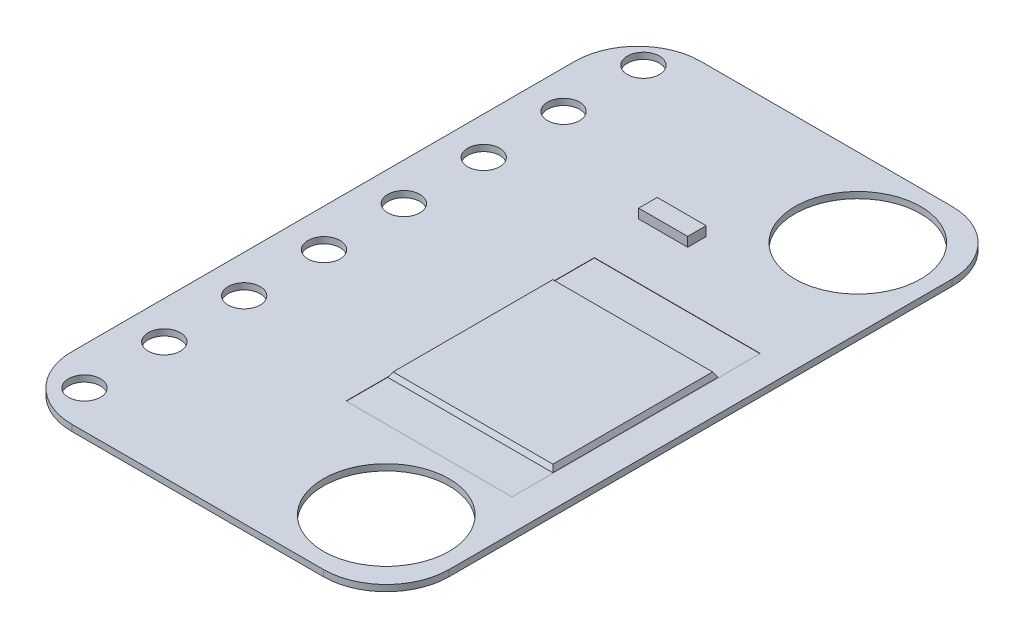
ISO-10303-21;
HEADER;
FILE_DESCRIPTION(('STEP AP214'),'2;1');
FILE_NAME('part.step','',(''),(''),'','','');
FILE_SCHEMA(('AUTOMOTIVE_DESIGN { 1 0 10303 214 1 1 1 1 }'));
ENDSEC;
DATA;
#1=APPLICATION_CONTEXT('core data for automotive mechanical design processes');
#2=APPLICATION_PROTOCOL_DEFINITION('international standard','automotive_design',2000,#1);
#3=PRODUCT_CONTEXT('',#1,'mechanical');
#4=PRODUCT('Part','Part','',(#3));
#5=PRODUCT_RELATED_PRODUCT_CATEGORY('part','',(#4));
#6=PRODUCT_DEFINITION_FORMATION('','',#4);
#7=PRODUCT_DEFINITION_CONTEXT('part definition',#1,'design');
#8=PRODUCT_DEFINITION('design','',#6,#7);
#9=PRODUCT_DEFINITION_SHAPE('','',#8);
#10=(LENGTH_UNIT() NAMED_UNIT(*) SI_UNIT(.MILLI.,.METRE.));
#11=(NAMED_UNIT(*) PLANE_ANGLE_UNIT() SI_UNIT($,.RADIAN.));
#12=(NAMED_UNIT(*) SI_UNIT($,.STERADIAN.) SOLID_ANGLE_UNIT());
#13=UNCERTAINTY_MEASURE_WITH_UNIT(LENGTH_MEASURE(1.E-05),#10,'distance_accuracy_value','');
#14=(GEOMETRIC_REPRESENTATION_CONTEXT(3) GLOBAL_UNCERTAINTY_ASSIGNED_CONTEXT((#13)) GLOBAL_UNIT_ASSIGNED_CONTEXT((#10,
#11,#12)) REPRESENTATION_CONTEXT('',''));
#15=CARTESIAN_POINT('',(0.,0.,0.));
#16=DIRECTION('',(0.,0.,1.));
#17=DIRECTION('',(1.,0.,0.));
#18=AXIS2_PLACEMENT_3D('',#15,#16,#17);
#19=CARTESIAN_POINT('',(-0.63915320341232,0.5,-5.25841947458053));
#20=DIRECTION('',(1.,0.,0.));
#21=DIRECTION('',(0.,0.,-1.));
#22=AXIS2_PLACEMENT_3D('',#19,#20,#21);
#23=PLANE('',#22);
#24=DIRECTION('',(0.,0.,1.));
#25=VECTOR('',#24,1.);
#26=CARTESIAN_POINT('',(-0.63915320341232,0.2,-5.25841947458053));
#27=LINE('',#26,#25);
#28=CARTESIAN_POINT('',(-0.63915320341232,0.2,-5.25841947458053));
#29=VERTEX_POINT('',#28);
#30=CARTESIAN_POINT('',(-0.63915320341232,0.2,-4.66969722864575));
#31=VERTEX_POINT('',#30);
#32=EDGE_CURVE('E106',#29,#31,#27,.T.);
#33=ORIENTED_EDGE('',*,*,#32,.T.);
#34=DIRECTION('',(0.,-1.,0.));
#35=VECTOR('',#34,1.);
#36=CARTESIAN_POINT('',(-0.63915320341232,0.5,-4.66969722864575));
#37=LINE('',#36,#35);
#38=CARTESIAN_POINT('',(-0.63915320341232,0.5,-4.66969722864575));
#39=VERTEX_POINT('',#38);
#40=EDGE_CURVE('E12',#39,#31,#37,.T.);
#41=ORIENTED_EDGE('',*,*,#40,.F.);
#42=DIRECTION('',(0.,0.,1.));
#43=VECTOR('',#42,1.);
#44=CARTESIAN_POINT('',(-0.63915320341232,0.5,-5.25841947458053));
#45=LINE('',#44,#43);
#46=CARTESIAN_POINT('',(-0.63915320341232,0.5,-5.25841947458053));
#47=VERTEX_POINT('',#46);
#48=EDGE_CURVE('E94',#47,#39,#45,.T.);
#49=ORIENTED_EDGE('',*,*,#48,.F.);
#50=DIRECTION('',(0.,-1.,0.));
#51=VECTOR('',#50,1.);
#52=CARTESIAN_POINT('',(-0.63915320341232,0.5,-5.25841947458053));
#53=LINE('',#52,#51);
#54=EDGE_CURVE('E102',#47,#29,#53,.T.);
#55=ORIENTED_EDGE('',*,*,#54,.T.);
#56=EDGE_LOOP('',(#33,#41,#49,#55));
#57=FACE_BOUND('',#56,.T.);
#58=ADVANCED_FACE('F43',(#57),#23,.F.);
#59=CARTESIAN_POINT('',(-0.63915320341232,0.5,-4.66969722864575));
#60=DIRECTION('',(0.,0.,-1.));
#61=DIRECTION('',(-1.,0.,0.));
#62=AXIS2_PLACEMENT_3D('',#59,#60,#61);
#63=PLANE('',#62);
#64=DIRECTION('',(1.,0.,0.));
#65=VECTOR('',#64,1.);
#66=CARTESIAN_POINT('',(-0.63915320341232,0.2,-4.66969722864575));
#67=LINE('',#66,#65);
#68=CARTESIAN_POINT('',(0.918112092286143,0.2,-4.66969722864575));
#69=VERTEX_POINT('',#68);
#70=EDGE_CURVE('E98',#31,#69,#67,.T.);
#71=ORIENTED_EDGE('',*,*,#70,.T.);
#72=DIRECTION('',(0.,-1.,0.));
#73=VECTOR('',#72,1.);
#74=CARTESIAN_POINT('',(0.918112092286143,0.5,-4.66969722864575));
#75=LINE('',#74,#73);
#76=CARTESIAN_POINT('',(0.918112092286143,0.5,-4.66969722864575));
#77=VERTEX_POINT('',#76);
#78=EDGE_CURVE('E51',#77,#69,#75,.T.);
#79=ORIENTED_EDGE('',*,*,#78,.F.);
#80=DIRECTION('',(1.,0.,0.));
#81=VECTOR('',#80,1.);
#82=CARTESIAN_POINT('',(-0.63915320341232,0.5,-4.66969722864575));
#83=LINE('',#82,#81);
#84=EDGE_CURVE('E89',#39,#77,#83,.T.);
#85=ORIENTED_EDGE('',*,*,#84,.F.);
#86=ORIENTED_EDGE('',*,*,#40,.T.);
#87=EDGE_LOOP('',(#71,#79,#85,#86));
#88=FACE_BOUND('',#87,.T.);
#89=ADVANCED_FACE('F97',(#88),#63,.F.);
#90=CARTESIAN_POINT('',(0.918112092286143,0.5,-5.25841947458053));
#91=DIRECTION('',(-1.,0.,0.));
#92=DIRECTION('',(0.,0.,1.));
#93=AXIS2_PLACEMENT_3D('',#90,#91,#92);
#94=PLANE('',#93);
#95=DIRECTION('',(0.,0.,-1.));
#96=VECTOR('',#95,1.);
#97=CARTESIAN_POINT('',(0.918112092286143,0.2,-5.25841947458053));
#98=LINE('',#97,#96);
#99=CARTESIAN_POINT('',(0.918112092286143,0.2,-5.25841947458053));
#100=VERTEX_POINT('',#99);
#101=EDGE_CURVE('E76',#69,#100,#98,.T.);
#102=ORIENTED_EDGE('',*,*,#101,.T.);
#103=DIRECTION('',(0.,-1.,0.));
#104=VECTOR('',#103,1.);
#105=CARTESIAN_POINT('',(0.918112092286143,0.5,-5.25841947458053));
#106=LINE('',#105,#104);
#107=CARTESIAN_POINT('',(0.918112092286143,0.5,-5.25841947458053));
#108=VERTEX_POINT('',#107);
#109=EDGE_CURVE('E99',#108,#100,#106,.T.);
#110=ORIENTED_EDGE('',*,*,#109,.F.);
#111=DIRECTION('',(0.,0.,-1.));
#112=VECTOR('',#111,1.);
#113=CARTESIAN_POINT('',(0.918112092286143,0.5,-5.25841947458053));
#114=LINE('',#113,#112);
#115=EDGE_CURVE('E92',#77,#108,#114,.T.);
#116=ORIENTED_EDGE('',*,*,#115,.F.);
#117=ORIENTED_EDGE('',*,*,#78,.T.);
#118=EDGE_LOOP('',(#102,#110,#116,#117));
#119=FACE_BOUND('',#118,.T.);
#120=ADVANCED_FACE('F100',(#119),#94,.F.);
#121=CARTESIAN_POINT('',(-0.63915320341232,0.5,-5.25841947458053));
#122=DIRECTION('',(0.,0.,1.));
#123=DIRECTION('',(1.,0.,0.));
#124=AXIS2_PLACEMENT_3D('',#121,#122,#123);
#125=PLANE('',#124);
#126=DIRECTION('',(-1.,0.,0.));
#127=VECTOR('',#126,1.);
#128=CARTESIAN_POINT('',(-0.63915320341232,0.2,-5.25841947458053));
#129=LINE('',#128,#127);
#130=EDGE_CURVE('E82',#100,#29,#129,.T.);
#131=ORIENTED_EDGE('',*,*,#130,.T.);
#132=ORIENTED_EDGE('',*,*,#54,.F.);
#133=DIRECTION('',(-1.,0.,0.));
#134=VECTOR('',#133,1.);
#135=CARTESIAN_POINT('',(-0.63915320341232,0.5,-5.25841947458053));
#136=LINE('',#135,#134);
#137=EDGE_CURVE('E59',#108,#47,#136,.T.);
#138=ORIENTED_EDGE('',*,*,#137,.F.);
#139=ORIENTED_EDGE('',*,*,#109,.T.);
#140=EDGE_LOOP('',(#131,#132,#138,#139));
#141=FACE_BOUND('',#140,.T.);
#142=ADVANCED_FACE('F113',(#141),#125,.F.);
#143=CARTESIAN_POINT('',(0.,0.5,0.));
#144=DIRECTION('',(0.,1.,0.));
#145=DIRECTION('',(0.,0.,1.));
#146=AXIS2_PLACEMENT_3D('',#143,#144,#145);
#147=PLANE('',#146);
#148=ORIENTED_EDGE('',*,*,#48,.T.);
#149=ORIENTED_EDGE('',*,*,#84,.T.);
#150=ORIENTED_EDGE('',*,*,#115,.T.);
#151=ORIENTED_EDGE('',*,*,#137,.T.);
#152=EDGE_LOOP('',(#148,#149,#150,#151));
#153=FACE_BOUND('',#152,.T.);
#154=ADVANCED_FACE('F90',(#153),#147,.T.);
#155=CARTESIAN_POINT('',(0.,0.2,0.));
#156=DIRECTION('',(0.,1.,0.));
#157=DIRECTION('',(0.,0.,1.));
#158=AXIS2_PLACEMENT_3D('',#155,#156,#157);
#159=PLANE('',#158);
#160=ORIENTED_EDGE('',*,*,#32,.F.);
#161=ORIENTED_EDGE('',*,*,#130,.F.);
#162=ORIENTED_EDGE('',*,*,#101,.F.);
#163=ORIENTED_EDGE('',*,*,#70,.F.);
#164=EDGE_LOOP('',(#160,#161,#162,#163));
#165=FACE_BOUND('',#164,.T.);
#166=ADVANCED_FACE('F116',(#165),#159,.F.);
#167=CLOSED_SHELL('',(#58,#89,#120,#142,#154,#166));
#168=MANIFOLD_SOLID_BREP('B2',#167);
#169=CARTESIAN_POINT('',(0.,0.19,0.));
#170=DIRECTION('',(0.,1.,0.));
#171=DIRECTION('',(0.,0.,1.));
#172=AXIS2_PLACEMENT_3D('',#169,#170,#171);
#173=PLANE('',#172);
#174=DIRECTION('',(0.,0.,-1.));
#175=VECTOR('',#174,1.);
#176=CARTESIAN_POINT('',(4.975,0.19,-1.57999999999997));
#177=LINE('',#176,#175);
#178=CARTESIAN_POINT('',(4.975,0.19,3.67500000000003));
#179=VERTEX_POINT('',#178);
#180=CARTESIAN_POINT('',(4.975,0.19,-1.57999999999997));
#181=VERTEX_POINT('',#180);
#182=EDGE_CURVE('E182',#179,#181,#177,.T.);
#183=ORIENTED_EDGE('',*,*,#182,.F.);
#184=DIRECTION('',(1.,0.,0.));
#185=VECTOR('',#184,1.);
#186=CARTESIAN_POINT('',(-0.279999999999999,0.19,3.67500000000003));
#187=LINE('',#186,#185);
#188=CARTESIAN_POINT('',(-0.279999999999999,0.19,3.67500000000003));
#189=VERTEX_POINT('',#188);
#190=EDGE_CURVE('E288',#189,#179,#187,.T.);
#191=ORIENTED_EDGE('',*,*,#190,.F.);
#192=DIRECTION('',(0.,0.,1.));
#193=VECTOR('',#192,1.);
#194=CARTESIAN_POINT('',(-0.279999999999999,0.19,-2.9));
#195=LINE('',#194,#193);
#196=CARTESIAN_POINT('',(-0.279999999999998,0.19,5.));
#197=VERTEX_POINT('',#196);
#198=EDGE_CURVE('E308',#189,#197,#195,.T.);
#199=ORIENTED_EDGE('',*,*,#198,.T.);
#200=DIRECTION('',(1.,0.,0.));
#201=VECTOR('',#200,1.);
#202=CARTESIAN_POINT('',(-0.279999999999998,0.19,5.));
#203=LINE('',#202,#201);
#204=CARTESIAN_POINT('',(5.,0.19,5.));
#205=VERTEX_POINT('',#204);
#206=EDGE_CURVE('E319',#197,#205,#203,.T.);
#207=ORIENTED_EDGE('',*,*,#206,.T.);
#208=DIRECTION('',(0.,0.,-1.));
#209=VECTOR('',#208,1.);
#210=CARTESIAN_POINT('',(5.,0.19,-2.9));
#211=LINE('',#210,#209);
#212=CARTESIAN_POINT('',(5.,0.19,-2.9));
#213=VERTEX_POINT('',#212);
#214=EDGE_CURVE('E327',#205,#213,#211,.T.);
#215=ORIENTED_EDGE('',*,*,#214,.T.);
#216=DIRECTION('',(-1.,0.,0.));
#217=VECTOR('',#216,1.);
#218=CARTESIAN_POINT('',(-0.279999999999999,0.19,-2.9));
#219=LINE('',#218,#217);
#220=CARTESIAN_POINT('',(-0.279999999999999,0.19,-2.9));
#221=VERTEX_POINT('',#220);
#222=EDGE_CURVE('E330',#213,#221,#219,.T.);
#223=ORIENTED_EDGE('',*,*,#222,.T.);
#224=CARTESIAN_POINT('',(-0.279999999999999,0.19,-1.57999999999997));
#225=VERTEX_POINT('',#224);
#226=EDGE_CURVE('E316',#221,#225,#195,.T.);
#227=ORIENTED_EDGE('',*,*,#226,.T.);
#228=DIRECTION('',(-1.,0.,0.));
#229=VECTOR('',#228,1.);
#230=CARTESIAN_POINT('',(-0.279999999999999,0.19,-1.57999999999997));
#231=LINE('',#230,#229);
#232=EDGE_CURVE('E658',#181,#225,#231,.T.);
#233=ORIENTED_EDGE('',*,*,#232,.F.);
#234=EDGE_LOOP('',(#183,#191,#199,#207,#215,#223,#227,#233));
#235=FACE_BOUND('',#234,.T.);
#236=ADVANCED_FACE('F167',(#235),#173,.T.);
#237=CARTESIAN_POINT('',(6.,0.2,-10.));
#238=DIRECTION('',(-1.,0.,0.));
#239=DIRECTION('',(0.,0.,1.));
#240=AXIS2_PLACEMENT_3D('',#237,#238,#239);
#241=PLANE('',#240);
#242=DIRECTION('',(0.,0.,-1.));
#243=VECTOR('',#242,1.);
#244=CARTESIAN_POINT('',(6.,0.,-10.));
#245=LINE('',#244,#243);
#246=CARTESIAN_POINT('',(6.,0.,8.));
#247=VERTEX_POINT('',#246);
#248=CARTESIAN_POINT('',(6.,0.,-8.));
#249=VERTEX_POINT('',#248);
#250=EDGE_CURVE('E396',#247,#249,#245,.T.);
#251=ORIENTED_EDGE('',*,*,#250,.T.);
#252=DIRECTION('',(0.,-1.,0.));
#253=VECTOR('',#252,1.);
#254=CARTESIAN_POINT('',(6.,0.2,-8.));
#255=LINE('',#254,#253);
#256=CARTESIAN_POINT('',(6.,0.2,-8.));
#257=VERTEX_POINT('',#256);
#258=EDGE_CURVE('E459',#249,#257,#255,.F.);
#259=ORIENTED_EDGE('',*,*,#258,.T.);
#260=DIRECTION('',(0.,0.,-1.));
#261=VECTOR('',#260,1.);
#262=CARTESIAN_POINT('',(6.,0.2,-10.));
#263=LINE('',#262,#261);
#264=CARTESIAN_POINT('',(6.,0.2,8.));
#265=VERTEX_POINT('',#264);
#266=EDGE_CURVE('E383',#265,#257,#263,.T.);
#267=ORIENTED_EDGE('',*,*,#266,.F.);
#268=DIRECTION('',(0.,-1.,0.));
#269=VECTOR('',#268,1.);
#270=CARTESIAN_POINT('',(6.,0.2,8.));
#271=LINE('',#270,#269);
#272=EDGE_CURVE('E456',#265,#247,#271,.T.);
#273=ORIENTED_EDGE('',*,*,#272,.T.);
#274=EDGE_LOOP('',(#251,#259,#267,#273));
#275=FACE_BOUND('',#274,.T.);
#276=ADVANCED_FACE('F463',(#275),#241,.F.);
#277=CARTESIAN_POINT('',(-6.,0.2,-10.));
#278=DIRECTION('',(0.,0.,1.));
#279=DIRECTION('',(1.,0.,0.));
#280=AXIS2_PLACEMENT_3D('',#277,#278,#279);
#281=PLANE('',#280);
#282=DIRECTION('',(-1.,0.,0.));
#283=VECTOR('',#282,1.);
#284=CARTESIAN_POINT('',(-6.,0.,-10.));
#285=LINE('',#284,#283);
#286=CARTESIAN_POINT('',(4.,0.,-10.));
#287=VERTEX_POINT('',#286);
#288=CARTESIAN_POINT('',(-4.,0.,-10.));
#289=VERTEX_POINT('',#288);
#290=EDGE_CURVE('E399',#287,#289,#285,.T.);
#291=ORIENTED_EDGE('',*,*,#290,.T.);
#292=DIRECTION('',(0.,-1.,0.));
#293=VECTOR('',#292,1.);
#294=CARTESIAN_POINT('',(-4.,0.2,-10.));
#295=LINE('',#294,#293);
#296=CARTESIAN_POINT('',(-4.,0.2,-10.));
#297=VERTEX_POINT('',#296);
#298=EDGE_CURVE('E446',#289,#297,#295,.F.);
#299=ORIENTED_EDGE('',*,*,#298,.T.);
#300=DIRECTION('',(-1.,0.,0.));
#301=VECTOR('',#300,1.);
#302=CARTESIAN_POINT('',(-6.,0.2,-10.));
#303=LINE('',#302,#301);
#304=CARTESIAN_POINT('',(4.,0.2,-10.));
#305=VERTEX_POINT('',#304);
#306=EDGE_CURVE('E386',#305,#297,#303,.T.);
#307=ORIENTED_EDGE('',*,*,#306,.F.);
#308=DIRECTION('',(0.,-1.,0.));
#309=VECTOR('',#308,1.);
#310=CARTESIAN_POINT('',(4.,0.2,-10.));
#311=LINE('',#310,#309);
#312=EDGE_CURVE('E443',#305,#287,#311,.T.);
#313=ORIENTED_EDGE('',*,*,#312,.T.);
#314=EDGE_LOOP('',(#291,#299,#307,#313));
#315=FACE_BOUND('',#314,.T.);
#316=ADVANCED_FACE('F476',(#315),#281,.F.);
#317=CARTESIAN_POINT('',(-6.,0.2,-10.));
#318=DIRECTION('',(1.,0.,0.));
#319=DIRECTION('',(0.,0.,-1.));
#320=AXIS2_PLACEMENT_3D('',#317,#318,#319);
#321=PLANE('',#320);
#322=DIRECTION('',(0.,0.,1.));
#323=VECTOR('',#322,1.);
#324=CARTESIAN_POINT('',(-6.,0.2,-10.));
#325=LINE('',#324,#323);
#326=CARTESIAN_POINT('',(-6.,0.2,-8.));
#327=VERTEX_POINT('',#326);
#328=CARTESIAN_POINT('',(-6.,0.2,8.));
#329=VERTEX_POINT('',#328);
#330=EDGE_CURVE('E390',#327,#329,#325,.T.);
#331=ORIENTED_EDGE('',*,*,#330,.F.);
#332=DIRECTION('',(0.,-1.,0.));
#333=VECTOR('',#332,1.);
#334=CARTESIAN_POINT('',(-6.,0.2,-8.));
#335=LINE('',#334,#333);
#336=CARTESIAN_POINT('',(-6.,0.,-8.));
#337=VERTEX_POINT('',#336);
#338=EDGE_CURVE('E432',#327,#337,#335,.T.);
#339=ORIENTED_EDGE('',*,*,#338,.T.);
#340=DIRECTION('',(0.,0.,1.));
#341=VECTOR('',#340,1.);
#342=CARTESIAN_POINT('',(-6.,0.,-10.));
#343=LINE('',#342,#341);
#344=CARTESIAN_POINT('',(-6.,0.,8.));
#345=VERTEX_POINT('',#344);
#346=EDGE_CURVE('E402',#337,#345,#343,.T.);
#347=ORIENTED_EDGE('',*,*,#346,.T.);
#348=DIRECTION('',(0.,-1.,0.));
#349=VECTOR('',#348,1.);
#350=CARTESIAN_POINT('',(-6.,0.2,8.));
#351=LINE('',#350,#349);
#352=EDGE_CURVE('E395',#345,#329,#351,.F.);
#353=ORIENTED_EDGE('',*,*,#352,.T.);
#354=EDGE_LOOP('',(#331,#339,#347,#353));
#355=FACE_BOUND('',#354,.T.);
#356=ADVANCED_FACE('F487',(#355),#321,.F.);
#357=CARTESIAN_POINT('',(-6.,0.2,10.));
#358=DIRECTION('',(0.,0.,-1.));
#359=DIRECTION('',(-1.,0.,0.));
#360=AXIS2_PLACEMENT_3D('',#357,#358,#359);
#361=PLANE('',#360);
#362=DIRECTION('',(1.,0.,0.));
#363=VECTOR('',#362,1.);
#364=CARTESIAN_POINT('',(-6.,0.2,10.));
#365=LINE('',#364,#363);
#366=CARTESIAN_POINT('',(-4.,0.2,10.));
#367=VERTEX_POINT('',#366);
#368=CARTESIAN_POINT('',(4.,0.2,10.));
#369=VERTEX_POINT('',#368);
#370=EDGE_CURVE('E393',#367,#369,#365,.T.);
#371=ORIENTED_EDGE('',*,*,#370,.F.);
#372=DIRECTION('',(0.,-1.,0.));
#373=VECTOR('',#372,1.);
#374=CARTESIAN_POINT('',(-4.,0.2,10.));
#375=LINE('',#374,#373);
#376=CARTESIAN_POINT('',(-4.,0.,10.));
#377=VERTEX_POINT('',#376);
#378=EDGE_CURVE('E41',#367,#377,#375,.T.);
#379=ORIENTED_EDGE('',*,*,#378,.T.);
#380=DIRECTION('',(1.,0.,0.));
#381=VECTOR('',#380,1.);
#382=CARTESIAN_POINT('',(-6.,0.,10.));
#383=LINE('',#382,#381);
#384=CARTESIAN_POINT('',(4.,0.,10.));
#385=VERTEX_POINT('',#384);
#386=EDGE_CURVE('E387',#377,#385,#383,.T.);
#387=ORIENTED_EDGE('',*,*,#386,.T.);
#388=DIRECTION('',(0.,-1.,0.));
#389=VECTOR('',#388,1.);
#390=CARTESIAN_POINT('',(4.,0.2,10.));
#391=LINE('',#390,#389);
#392=EDGE_CURVE('E175',#385,#369,#391,.F.);
#393=ORIENTED_EDGE('',*,*,#392,.T.);
#394=EDGE_LOOP('',(#371,#379,#387,#393));
#395=FACE_BOUND('',#394,.T.);
#396=ADVANCED_FACE('F494',(#395),#361,.F.);
#397=CARTESIAN_POINT('',(0.,0.2,0.));
#398=DIRECTION('',(0.,1.,0.));
#399=DIRECTION('',(0.,0.,1.));
#400=AXIS2_PLACEMENT_3D('',#397,#398,#399);
#401=PLANE('',#400);
#402=DIRECTION('',(0.,0.,1.));
#403=VECTOR('',#402,1.);
#404=CARTESIAN_POINT('',(-0.279999999999999,0.2,-2.9));
#405=LINE('',#404,#403);
#406=CARTESIAN_POINT('',(-0.279999999999999,0.2,-2.9));
#407=VERTEX_POINT('',#406);
#408=CARTESIAN_POINT('',(-0.279999999999998,0.2,5.));
#409=VERTEX_POINT('',#408);
#410=EDGE_CURVE('E333',#407,#409,#405,.T.);
#411=ORIENTED_EDGE('',*,*,#410,.F.);
#412=DIRECTION('',(-1.,0.,0.));
#413=VECTOR('',#412,1.);
#414=CARTESIAN_POINT('',(-0.279999999999999,0.2,-2.9));
#415=LINE('',#414,#413);
#416=CARTESIAN_POINT('',(5.,0.2,-2.9));
#417=VERTEX_POINT('',#416);
#418=EDGE_CURVE('E317',#417,#407,#415,.T.);
#419=ORIENTED_EDGE('',*,*,#418,.F.);
#420=DIRECTION('',(0.,0.,-1.));
#421=VECTOR('',#420,1.);
#422=CARTESIAN_POINT('',(5.,0.2,-2.9));
#423=LINE('',#422,#421);
#424=CARTESIAN_POINT('',(5.,0.2,5.));
#425=VERTEX_POINT('',#424);
#426=EDGE_CURVE('E321',#425,#417,#423,.T.);
#427=ORIENTED_EDGE('',*,*,#426,.F.);
#428=DIRECTION('',(1.,0.,0.));
#429=VECTOR('',#428,1.);
#430=CARTESIAN_POINT('',(-0.279999999999998,0.2,5.));
#431=LINE('',#430,#429);
#432=EDGE_CURVE('E335',#409,#425,#431,.T.);
#433=ORIENTED_EDGE('',*,*,#432,.F.);
#434=EDGE_LOOP('',(#411,#419,#427,#433));
#435=FACE_BOUND('',#434,.T.);
#436=CARTESIAN_POINT('',(3.5,0.2,7.5));
#437=DIRECTION('',(0.,1.,0.));
#438=DIRECTION('',(0.,0.,-1.));
#439=AXIS2_PLACEMENT_3D('',#436,#437,#438);
#440=CIRCLE('',#439,2.);
#441=CARTESIAN_POINT('',(3.5,0.2,5.5));
#442=VERTEX_POINT('',#441);
#443=EDGE_CURVE('E343',#442,#442,#440,.T.);
#444=ORIENTED_EDGE('',*,*,#443,.F.);
#445=EDGE_LOOP('',(#444));
#446=FACE_BOUND('',#445,.T.);
#447=CARTESIAN_POINT('',(3.5,0.2,-7.5));
#448=DIRECTION('',(0.,1.,0.));
#449=DIRECTION('',(0.,0.,1.));
#450=AXIS2_PLACEMENT_3D('',#447,#448,#449);
#451=CIRCLE('',#450,2.);
#452=CARTESIAN_POINT('',(3.5,0.2,-5.5));
#453=VERTEX_POINT('',#452);
#454=EDGE_CURVE('E352',#453,#453,#451,.T.);
#455=ORIENTED_EDGE('',*,*,#454,.F.);
#456=EDGE_LOOP('',(#455));
#457=FACE_BOUND('',#456,.T.);
#458=CARTESIAN_POINT('',(-4.8,0.2,6.26));
#459=DIRECTION('',(0.,1.,0.));
#460=DIRECTION('',(0.,0.,1.));
#461=AXIS2_PLACEMENT_3D('',#458,#459,#460);
#462=CIRCLE('',#461,0.51);
#463=CARTESIAN_POINT('',(-4.8,0.2,6.77));
#464=VERTEX_POINT('',#463);
#465=EDGE_CURVE('E356',#464,#464,#462,.T.);
#466=ORIENTED_EDGE('',*,*,#465,.F.);
#467=EDGE_LOOP('',(#466));
#468=FACE_BOUND('',#467,.T.);
#469=CARTESIAN_POINT('',(-4.8,0.2,3.72));
#470=DIRECTION('',(0.,1.,0.));
#471=DIRECTION('',(0.,0.,1.));
#472=AXIS2_PLACEMENT_3D('',#469,#470,#471);
#473=CIRCLE('',#472,0.51);
#474=CARTESIAN_POINT('',(-4.8,0.2,4.23));
#475=VERTEX_POINT('',#474);
#476=EDGE_CURVE('E360',#475,#475,#473,.T.);
#477=ORIENTED_EDGE('',*,*,#476,.F.);
#478=EDGE_LOOP('',(#477));
#479=FACE_BOUND('',#478,.T.);
#480=CARTESIAN_POINT('',(-4.8,0.2,1.18));
#481=DIRECTION('',(0.,1.,0.));
#482=DIRECTION('',(0.,0.,1.));
#483=AXIS2_PLACEMENT_3D('',#480,#481,#482);
#484=CIRCLE('',#483,0.51);
#485=CARTESIAN_POINT('',(-4.8,0.2,1.69));
#486=VERTEX_POINT('',#485);
#487=EDGE_CURVE('E363',#486,#486,#484,.T.);
#488=ORIENTED_EDGE('',*,*,#487,.F.);
#489=EDGE_LOOP('',(#488));
#490=FACE_BOUND('',#489,.T.);
#491=CARTESIAN_POINT('',(-4.8,0.2,-1.36));
#492=DIRECTION('',(0.,1.,0.));
#493=DIRECTION('',(0.,0.,1.));
#494=AXIS2_PLACEMENT_3D('',#491,#492,#493);
#495=CIRCLE('',#494,0.51);
#496=CARTESIAN_POINT('',(-4.8,0.2,-0.849999999999997));
#497=VERTEX_POINT('',#496);
#498=EDGE_CURVE('E366',#497,#497,#495,.T.);
#499=ORIENTED_EDGE('',*,*,#498,.F.);
#500=EDGE_LOOP('',(#499));
#501=FACE_BOUND('',#500,.T.);
#502=CARTESIAN_POINT('',(-4.8,0.2,-3.9));
#503=DIRECTION('',(0.,1.,0.));
#504=DIRECTION('',(0.,0.,1.));
#505=AXIS2_PLACEMENT_3D('',#502,#503,#504);
#506=CIRCLE('',#505,0.51);
#507=CARTESIAN_POINT('',(-4.8,0.2,-3.39));
#508=VERTEX_POINT('',#507);
#509=EDGE_CURVE('E369',#508,#508,#506,.T.);
#510=ORIENTED_EDGE('',*,*,#509,.F.);
#511=EDGE_LOOP('',(#510));
#512=FACE_BOUND('',#511,.T.);
#513=CARTESIAN_POINT('',(-4.8,0.2,-6.44));
#514=DIRECTION('',(0.,1.,0.));
#515=DIRECTION('',(0.,0.,1.));
#516=AXIS2_PLACEMENT_3D('',#513,#514,#515);
#517=CIRCLE('',#516,0.51);
#518=CARTESIAN_POINT('',(-4.8,0.2,-5.93));
#519=VERTEX_POINT('',#518);
#520=EDGE_CURVE('E372',#519,#519,#517,.T.);
#521=ORIENTED_EDGE('',*,*,#520,.F.);
#522=EDGE_LOOP('',(#521));
#523=FACE_BOUND('',#522,.T.);
#524=CARTESIAN_POINT('',(-4.8,0.2,-8.98));
#525=DIRECTION('',(0.,1.,0.));
#526=DIRECTION('',(0.,0.,1.));
#527=AXIS2_PLACEMENT_3D('',#524,#525,#526);
#528=CIRCLE('',#527,0.51);
#529=CARTESIAN_POINT('',(-4.8,0.2,-8.47));
#530=VERTEX_POINT('',#529);
#531=EDGE_CURVE('E375',#530,#530,#528,.T.);
#532=ORIENTED_EDGE('',*,*,#531,.F.);
#533=EDGE_LOOP('',(#532));
#534=FACE_BOUND('',#533,.T.);
#535=CARTESIAN_POINT('',(-4.8,0.2,8.8));
#536=DIRECTION('',(0.,1.,0.));
#537=DIRECTION('',(0.,0.,1.));
#538=AXIS2_PLACEMENT_3D('',#535,#536,#537);
#539=CIRCLE('',#538,0.51);
#540=CARTESIAN_POINT('',(-4.8,0.2,9.31));
#541=VERTEX_POINT('',#540);
#542=EDGE_CURVE('E378',#541,#541,#539,.T.);
#543=ORIENTED_EDGE('',*,*,#542,.F.);
#544=EDGE_LOOP('',(#543));
#545=FACE_BOUND('',#544,.T.);
#546=ORIENTED_EDGE('',*,*,#306,.T.);
#547=CARTESIAN_POINT('',(-4.,0.2,-8.));
#548=DIRECTION('',(0.,1.,0.));
#549=DIRECTION('',(0.,0.,1.));
#550=AXIS2_PLACEMENT_3D('',#547,#548,#549);
#551=CIRCLE('',#550,2.);
#552=EDGE_CURVE('E454',#297,#327,#551,.T.);
#553=ORIENTED_EDGE('',*,*,#552,.T.);
#554=ORIENTED_EDGE('',*,*,#330,.T.);
#555=CARTESIAN_POINT('',(-4.,0.2,8.));
#556=DIRECTION('',(0.,1.,0.));
#557=DIRECTION('',(0.,0.,1.));
#558=AXIS2_PLACEMENT_3D('',#555,#556,#557);
#559=CIRCLE('',#558,2.);
#560=EDGE_CURVE('E450',#329,#367,#559,.T.);
#561=ORIENTED_EDGE('',*,*,#560,.T.);
#562=ORIENTED_EDGE('',*,*,#370,.T.);
#563=CARTESIAN_POINT('',(4.,0.2,8.));
#564=DIRECTION('',(0.,1.,0.));
#565=DIRECTION('',(0.,0.,1.));
#566=AXIS2_PLACEMENT_3D('',#563,#564,#565);
#567=CIRCLE('',#566,2.);
#568=EDGE_CURVE('E448',#369,#265,#567,.T.);
#569=ORIENTED_EDGE('',*,*,#568,.T.);
#570=ORIENTED_EDGE('',*,*,#266,.T.);
#571=CARTESIAN_POINT('',(4.,0.2,-8.));
#572=DIRECTION('',(0.,1.,0.));
#573=DIRECTION('',(0.,0.,1.));
#574=AXIS2_PLACEMENT_3D('',#571,#572,#573);
#575=CIRCLE('',#574,2.);
#576=EDGE_CURVE('E452',#257,#305,#575,.T.);
#577=ORIENTED_EDGE('',*,*,#576,.T.);
#578=EDGE_LOOP('',(#546,#553,#554,#561,#562,#569,#570,#577));
#579=FACE_BOUND('',#578,.T.);
#580=ADVANCED_FACE('F469',(#435,#446,#457,#468,#479,#490,#501,#512,#523,#534,#545,#579),#401,.T.);
#581=CARTESIAN_POINT('',(0.,0.,0.));
#582=DIRECTION('',(0.,1.,0.));
#583=DIRECTION('',(0.,0.,1.));
#584=AXIS2_PLACEMENT_3D('',#581,#582,#583);
#585=PLANE('',#584);
#586=CARTESIAN_POINT('',(3.5,0.,7.5));
#587=DIRECTION('',(0.,1.,0.));
#588=DIRECTION('',(0.,0.,1.));
#589=AXIS2_PLACEMENT_3D('',#586,#587,#588);
#590=CIRCLE('',#589,2.);
#591=CARTESIAN_POINT('',(3.5,0.,9.5));
#592=VERTEX_POINT('',#591);
#593=EDGE_CURVE('E351',#592,#592,#590,.T.);
#594=ORIENTED_EDGE('',*,*,#593,.T.);
#595=EDGE_LOOP('',(#594));
#596=FACE_BOUND('',#595,.T.);
#597=CARTESIAN_POINT('',(3.5,0.,-7.5));
#598=DIRECTION('',(0.,1.,0.));
#599=DIRECTION('',(0.,0.,1.));
#600=AXIS2_PLACEMENT_3D('',#597,#598,#599);
#601=CIRCLE('',#600,2.);
#602=CARTESIAN_POINT('',(3.5,0.,-5.5));
#603=VERTEX_POINT('',#602);
#604=EDGE_CURVE('E355',#603,#603,#601,.T.);
#605=ORIENTED_EDGE('',*,*,#604,.T.);
#606=EDGE_LOOP('',(#605));
#607=FACE_BOUND('',#606,.T.);
#608=CARTESIAN_POINT('',(-4.8,0.,6.26));
#609=DIRECTION('',(0.,1.,0.));
#610=DIRECTION('',(0.,0.,1.));
#611=AXIS2_PLACEMENT_3D('',#608,#609,#610);
#612=CIRCLE('',#611,0.51);
#613=CARTESIAN_POINT('',(-4.8,0.,6.77));
#614=VERTEX_POINT('',#613);
#615=EDGE_CURVE('E382',#614,#614,#612,.T.);
#616=ORIENTED_EDGE('',*,*,#615,.T.);
#617=EDGE_LOOP('',(#616));
#618=FACE_BOUND('',#617,.T.);
#619=CARTESIAN_POINT('',(-4.8,0.,3.72));
#620=DIRECTION('',(0.,1.,0.));
#621=DIRECTION('',(0.,0.,1.));
#622=AXIS2_PLACEMENT_3D('',#619,#620,#621);
#623=CIRCLE('',#622,0.51);
#624=CARTESIAN_POINT('',(-4.8,0.,4.23));
#625=VERTEX_POINT('',#624);
#626=EDGE_CURVE('E422',#625,#625,#623,.T.);
#627=ORIENTED_EDGE('',*,*,#626,.T.);
#628=EDGE_LOOP('',(#627));
#629=FACE_BOUND('',#628,.T.);
#630=CARTESIAN_POINT('',(-4.8,0.,1.18));
#631=DIRECTION('',(0.,1.,0.));
#632=DIRECTION('',(0.,0.,1.));
#633=AXIS2_PLACEMENT_3D('',#630,#631,#632);
#634=CIRCLE('',#633,0.51);
#635=CARTESIAN_POINT('',(-4.8,0.,1.69));
#636=VERTEX_POINT('',#635);
#637=EDGE_CURVE('E419',#636,#636,#634,.T.);
#638=ORIENTED_EDGE('',*,*,#637,.T.);
#639=EDGE_LOOP('',(#638));
#640=FACE_BOUND('',#639,.T.);
#641=CARTESIAN_POINT('',(-4.8,0.,-1.36));
#642=DIRECTION('',(0.,1.,0.));
#643=DIRECTION('',(0.,0.,1.));
#644=AXIS2_PLACEMENT_3D('',#641,#642,#643);
#645=CIRCLE('',#644,0.51);
#646=CARTESIAN_POINT('',(-4.8,0.,-0.849999999999997));
#647=VERTEX_POINT('',#646);
#648=EDGE_CURVE('E416',#647,#647,#645,.T.);
#649=ORIENTED_EDGE('',*,*,#648,.T.);
#650=EDGE_LOOP('',(#649));
#651=FACE_BOUND('',#650,.T.);
#652=CARTESIAN_POINT('',(-4.8,0.,-3.9));
#653=DIRECTION('',(0.,1.,0.));
#654=DIRECTION('',(0.,0.,1.));
#655=AXIS2_PLACEMENT_3D('',#652,#653,#654);
#656=CIRCLE('',#655,0.51);
#657=CARTESIAN_POINT('',(-4.8,0.,-3.39));
#658=VERTEX_POINT('',#657);
#659=EDGE_CURVE('E413',#658,#658,#656,.T.);
#660=ORIENTED_EDGE('',*,*,#659,.T.);
#661=EDGE_LOOP('',(#660));
#662=FACE_BOUND('',#661,.T.);
#663=CARTESIAN_POINT('',(-4.8,0.,-6.44));
#664=DIRECTION('',(0.,1.,0.));
#665=DIRECTION('',(0.,0.,1.));
#666=AXIS2_PLACEMENT_3D('',#663,#664,#665);
#667=CIRCLE('',#666,0.51);
#668=CARTESIAN_POINT('',(-4.8,0.,-5.93));
#669=VERTEX_POINT('',#668);
#670=EDGE_CURVE('E410',#669,#669,#667,.T.);
#671=ORIENTED_EDGE('',*,*,#670,.T.);
#672=EDGE_LOOP('',(#671));
#673=FACE_BOUND('',#672,.T.);
#674=CARTESIAN_POINT('',(-4.8,0.,-8.98));
#675=DIRECTION('',(0.,1.,0.));
#676=DIRECTION('',(0.,0.,1.));
#677=AXIS2_PLACEMENT_3D('',#674,#675,#676);
#678=CIRCLE('',#677,0.51);
#679=CARTESIAN_POINT('',(-4.8,0.,-8.47));
#680=VERTEX_POINT('',#679);
#681=EDGE_CURVE('E359',#680,#680,#678,.T.);
#682=ORIENTED_EDGE('',*,*,#681,.T.);
#683=EDGE_LOOP('',(#682));
#684=FACE_BOUND('',#683,.T.);
#685=CARTESIAN_POINT('',(-4.8,0.,8.8));
#686=DIRECTION('',(0.,1.,0.));
#687=DIRECTION('',(0.,0.,1.));
#688=AXIS2_PLACEMENT_3D('',#685,#686,#687);
#689=CIRCLE('',#688,0.51);
#690=CARTESIAN_POINT('',(-4.8,0.,9.31));
#691=VERTEX_POINT('',#690);
#692=EDGE_CURVE('E381',#691,#691,#689,.T.);
#693=ORIENTED_EDGE('',*,*,#692,.T.);
#694=EDGE_LOOP('',(#693));
#695=FACE_BOUND('',#694,.T.);
#696=ORIENTED_EDGE('',*,*,#346,.F.);
#697=CARTESIAN_POINT('',(-4.,0.,-8.));
#698=DIRECTION('',(0.,1.,0.));
#699=DIRECTION('',(0.,0.,1.));
#700=AXIS2_PLACEMENT_3D('',#697,#698,#699);
#701=CIRCLE('',#700,2.);
#702=EDGE_CURVE('E441',#337,#289,#701,.F.);
#703=ORIENTED_EDGE('',*,*,#702,.T.);
#704=ORIENTED_EDGE('',*,*,#290,.F.);
#705=CARTESIAN_POINT('',(4.,0.,-8.));
#706=DIRECTION('',(0.,1.,0.));
#707=DIRECTION('',(0.,0.,1.));
#708=AXIS2_PLACEMENT_3D('',#705,#706,#707);
#709=CIRCLE('',#708,2.);
#710=EDGE_CURVE('E439',#287,#249,#709,.F.);
#711=ORIENTED_EDGE('',*,*,#710,.T.);
#712=ORIENTED_EDGE('',*,*,#250,.F.);
#713=CARTESIAN_POINT('',(4.,0.,8.));
#714=DIRECTION('',(0.,1.,0.));
#715=DIRECTION('',(0.,0.,1.));
#716=AXIS2_PLACEMENT_3D('',#713,#714,#715);
#717=CIRCLE('',#716,2.);
#718=EDGE_CURVE('E435',#247,#385,#717,.F.);
#719=ORIENTED_EDGE('',*,*,#718,.T.);
#720=ORIENTED_EDGE('',*,*,#386,.F.);
#721=CARTESIAN_POINT('',(-4.,0.,8.));
#722=DIRECTION('',(0.,1.,0.));
#723=DIRECTION('',(0.,0.,1.));
#724=AXIS2_PLACEMENT_3D('',#721,#722,#723);
#725=CIRCLE('',#724,2.);
#726=EDGE_CURVE('E437',#377,#345,#725,.F.);
#727=ORIENTED_EDGE('',*,*,#726,.T.);
#728=EDGE_LOOP('',(#696,#703,#704,#711,#712,#719,#720,#727));
#729=FACE_BOUND('',#728,.T.);
#730=ADVANCED_FACE('F480',(#596,#607,#618,#629,#640,#651,#662,#673,#684,#695,#729),#585,.F.);
#731=CARTESIAN_POINT('',(-4.8,-0.8,8.8));
#732=DIRECTION('',(0.,1.,0.));
#733=DIRECTION('',(0.,0.,1.));
#734=AXIS2_PLACEMENT_3D('',#731,#732,#733);
#735=CYLINDRICAL_SURFACE('',#734,0.51);
#736=ORIENTED_EDGE('',*,*,#542,.T.);
#737=EDGE_LOOP('',(#736));
#738=FACE_BOUND('',#737,.T.);
#739=ORIENTED_EDGE('',*,*,#692,.F.);
#740=EDGE_LOOP('',(#739));
#741=FACE_BOUND('',#740,.T.);
#742=ADVANCED_FACE('F560',(#738,#741),#735,.F.);
#743=CARTESIAN_POINT('',(-4.8,-0.8,-8.98));
#744=DIRECTION('',(0.,1.,0.));
#745=DIRECTION('',(0.,0.,1.));
#746=AXIS2_PLACEMENT_3D('',#743,#744,#745);
#747=CYLINDRICAL_SURFACE('',#746,0.51);
#748=ORIENTED_EDGE('',*,*,#531,.T.);
#749=EDGE_LOOP('',(#748));
#750=FACE_BOUND('',#749,.T.);
#751=ORIENTED_EDGE('',*,*,#681,.F.);
#752=EDGE_LOOP('',(#751));
#753=FACE_BOUND('',#752,.T.);
#754=ADVANCED_FACE('F556',(#750,#753),#747,.F.);
#755=CARTESIAN_POINT('',(-4.8,-0.8,-6.44));
#756=DIRECTION('',(0.,1.,0.));
#757=DIRECTION('',(0.,0.,1.));
#758=AXIS2_PLACEMENT_3D('',#755,#756,#757);
#759=CYLINDRICAL_SURFACE('',#758,0.51);
#760=ORIENTED_EDGE('',*,*,#520,.T.);
#761=EDGE_LOOP('',(#760));
#762=FACE_BOUND('',#761,.T.);
#763=ORIENTED_EDGE('',*,*,#670,.F.);
#764=EDGE_LOOP('',(#763));
#765=FACE_BOUND('',#764,.T.);
#766=ADVANCED_FACE('F552',(#762,#765),#759,.F.);
#767=CARTESIAN_POINT('',(-4.8,-0.8,-3.9));
#768=DIRECTION('',(0.,1.,0.));
#769=DIRECTION('',(0.,0.,1.));
#770=AXIS2_PLACEMENT_3D('',#767,#768,#769);
#771=CYLINDRICAL_SURFACE('',#770,0.51);
#772=ORIENTED_EDGE('',*,*,#509,.T.);
#773=EDGE_LOOP('',(#772));
#774=FACE_BOUND('',#773,.T.);
#775=ORIENTED_EDGE('',*,*,#659,.F.);
#776=EDGE_LOOP('',(#775));
#777=FACE_BOUND('',#776,.T.);
#778=ADVANCED_FACE('F548',(#774,#777),#771,.F.);
#779=CARTESIAN_POINT('',(-4.8,-0.8,-1.36));
#780=DIRECTION('',(0.,1.,0.));
#781=DIRECTION('',(0.,0.,1.));
#782=AXIS2_PLACEMENT_3D('',#779,#780,#781);
#783=CYLINDRICAL_SURFACE('',#782,0.51);
#784=ORIENTED_EDGE('',*,*,#498,.T.);
#785=EDGE_LOOP('',(#784));
#786=FACE_BOUND('',#785,.T.);
#787=ORIENTED_EDGE('',*,*,#648,.F.);
#788=EDGE_LOOP('',(#787));
#789=FACE_BOUND('',#788,.T.);
#790=ADVANCED_FACE('F544',(#786,#789),#783,.F.);
#791=CARTESIAN_POINT('',(-4.8,-0.8,1.18));
#792=DIRECTION('',(0.,1.,0.));
#793=DIRECTION('',(0.,0.,1.));
#794=AXIS2_PLACEMENT_3D('',#791,#792,#793);
#795=CYLINDRICAL_SURFACE('',#794,0.51);
#796=ORIENTED_EDGE('',*,*,#487,.T.);
#797=EDGE_LOOP('',(#796));
#798=FACE_BOUND('',#797,.T.);
#799=ORIENTED_EDGE('',*,*,#637,.F.);
#800=EDGE_LOOP('',(#799));
#801=FACE_BOUND('',#800,.T.);
#802=ADVANCED_FACE('F540',(#798,#801),#795,.F.);
#803=CARTESIAN_POINT('',(-4.8,-0.8,3.72));
#804=DIRECTION('',(0.,1.,0.));
#805=DIRECTION('',(0.,0.,1.));
#806=AXIS2_PLACEMENT_3D('',#803,#804,#805);
#807=CYLINDRICAL_SURFACE('',#806,0.51);
#808=ORIENTED_EDGE('',*,*,#476,.T.);
#809=EDGE_LOOP('',(#808));
#810=FACE_BOUND('',#809,.T.);
#811=ORIENTED_EDGE('',*,*,#626,.F.);
#812=EDGE_LOOP('',(#811));
#813=FACE_BOUND('',#812,.T.);
#814=ADVANCED_FACE('F536',(#810,#813),#807,.F.);
#815=CARTESIAN_POINT('',(-4.8,-0.8,6.26));
#816=DIRECTION('',(0.,1.,0.));
#817=DIRECTION('',(0.,0.,1.));
#818=AXIS2_PLACEMENT_3D('',#815,#816,#817);
#819=CYLINDRICAL_SURFACE('',#818,0.51);
#820=ORIENTED_EDGE('',*,*,#465,.T.);
#821=EDGE_LOOP('',(#820));
#822=FACE_BOUND('',#821,.T.);
#823=ORIENTED_EDGE('',*,*,#615,.F.);
#824=EDGE_LOOP('',(#823));
#825=FACE_BOUND('',#824,.T.);
#826=ADVANCED_FACE('F532',(#822,#825),#819,.F.);
#827=CARTESIAN_POINT('',(3.5,-0.8,-7.5));
#828=DIRECTION('',(0.,1.,0.));
#829=DIRECTION('',(0.,0.,1.));
#830=AXIS2_PLACEMENT_3D('',#827,#828,#829);
#831=CYLINDRICAL_SURFACE('',#830,2.);
#832=ORIENTED_EDGE('',*,*,#454,.T.);
#833=EDGE_LOOP('',(#832));
#834=FACE_BOUND('',#833,.T.);
#835=ORIENTED_EDGE('',*,*,#604,.F.);
#836=EDGE_LOOP('',(#835));
#837=FACE_BOUND('',#836,.T.);
#838=ADVANCED_FACE('F528',(#834,#837),#831,.F.);
#839=CARTESIAN_POINT('',(3.5,-0.8,7.5));
#840=DIRECTION('',(0.,1.,0.));
#841=DIRECTION('',(0.,0.,1.));
#842=AXIS2_PLACEMENT_3D('',#839,#840,#841);
#843=CYLINDRICAL_SURFACE('',#842,2.);
#844=ORIENTED_EDGE('',*,*,#443,.T.);
#845=EDGE_LOOP('',(#844));
#846=FACE_BOUND('',#845,.T.);
#847=ORIENTED_EDGE('',*,*,#593,.F.);
#848=EDGE_LOOP('',(#847));
#849=FACE_BOUND('',#848,.T.);
#850=ADVANCED_FACE('F525',(#846,#849),#843,.F.);
#851=CARTESIAN_POINT('',(-0.279999999999999,0.19,-2.9));
#852=DIRECTION('',(-1.,0.,0.));
#853=DIRECTION('',(0.,0.,1.));
#854=AXIS2_PLACEMENT_3D('',#851,#852,#853);
#855=PLANE('',#854);
#856=ORIENTED_EDGE('',*,*,#410,.T.);
#857=DIRECTION('',(0.,1.,0.));
#858=VECTOR('',#857,1.);
#859=CARTESIAN_POINT('',(-0.279999999999998,0.19,5.));
#860=LINE('',#859,#858);
#861=EDGE_CURVE('E314',#197,#409,#860,.T.);
#862=ORIENTED_EDGE('',*,*,#861,.F.);
#863=ORIENTED_EDGE('',*,*,#198,.F.);
#864=DIRECTION('',(0.,0.,1.));
#865=VECTOR('',#864,1.);
#866=CARTESIAN_POINT('',(-0.279999999999999,0.19,-1.57999999999997));
#867=LINE('',#866,#865);
#868=EDGE_CURVE('E296',#225,#189,#867,.T.);
#869=ORIENTED_EDGE('',*,*,#868,.F.);
#870=ORIENTED_EDGE('',*,*,#226,.F.);
#871=DIRECTION('',(0.,1.,0.));
#872=VECTOR('',#871,1.);
#873=CARTESIAN_POINT('',(-0.279999999999999,0.19,-2.9));
#874=LINE('',#873,#872);
#875=EDGE_CURVE('E341',#221,#407,#874,.T.);
#876=ORIENTED_EDGE('',*,*,#875,.T.);
#877=EDGE_LOOP('',(#856,#862,#863,#869,#870,#876));
#878=FACE_BOUND('',#877,.T.);
#879=ADVANCED_FACE('F312',(#878),#855,.F.);
#880=CARTESIAN_POINT('',(-0.279999999999999,0.19,-2.9));
#881=DIRECTION('',(0.,0.,-1.));
#882=DIRECTION('',(-1.,0.,0.));
#883=AXIS2_PLACEMENT_3D('',#880,#881,#882);
#884=PLANE('',#883);
#885=ORIENTED_EDGE('',*,*,#418,.T.);
#886=ORIENTED_EDGE('',*,*,#875,.F.);
#887=ORIENTED_EDGE('',*,*,#222,.F.);
#888=DIRECTION('',(0.,1.,0.));
#889=VECTOR('',#888,1.);
#890=CARTESIAN_POINT('',(5.,0.19,-2.9));
#891=LINE('',#890,#889);
#892=EDGE_CURVE('E344',#213,#417,#891,.T.);
#893=ORIENTED_EDGE('',*,*,#892,.T.);
#894=EDGE_LOOP('',(#885,#886,#887,#893));
#895=FACE_BOUND('',#894,.T.);
#896=ADVANCED_FACE('F511',(#895),#884,.F.);
#897=CARTESIAN_POINT('',(5.,0.19,-2.9));
#898=DIRECTION('',(1.,0.,0.));
#899=DIRECTION('',(0.,0.,-1.));
#900=AXIS2_PLACEMENT_3D('',#897,#898,#899);
#901=PLANE('',#900);
#902=ORIENTED_EDGE('',*,*,#426,.T.);
#903=ORIENTED_EDGE('',*,*,#892,.F.);
#904=ORIENTED_EDGE('',*,*,#214,.F.);
#905=DIRECTION('',(0.,1.,0.));
#906=VECTOR('',#905,1.);
#907=CARTESIAN_POINT('',(5.,0.19,5.));
#908=LINE('',#907,#906);
#909=EDGE_CURVE('E346',#205,#425,#908,.T.);
#910=ORIENTED_EDGE('',*,*,#909,.T.);
#911=EDGE_LOOP('',(#902,#903,#904,#910));
#912=FACE_BOUND('',#911,.T.);
#913=ADVANCED_FACE('F514',(#912),#901,.F.);
#914=CARTESIAN_POINT('',(-0.279999999999998,0.19,5.));
#915=DIRECTION('',(0.,0.,1.));
#916=DIRECTION('',(1.,0.,0.));
#917=AXIS2_PLACEMENT_3D('',#914,#915,#916);
#918=PLANE('',#917);
#919=ORIENTED_EDGE('',*,*,#432,.T.);
#920=ORIENTED_EDGE('',*,*,#909,.F.);
#921=ORIENTED_EDGE('',*,*,#206,.F.);
#922=ORIENTED_EDGE('',*,*,#861,.T.);
#923=EDGE_LOOP('',(#919,#920,#921,#922));
#924=FACE_BOUND('',#923,.T.);
#925=ADVANCED_FACE('F518',(#924),#918,.F.);
#926=CARTESIAN_POINT('',(-4.,0.2,-8.));
#927=DIRECTION('',(0.,-1.,0.));
#928=DIRECTION('',(0.,0.,-1.));
#929=AXIS2_PLACEMENT_3D('',#926,#927,#928);
#930=CYLINDRICAL_SURFACE('',#929,2.);
#931=ORIENTED_EDGE('',*,*,#552,.F.);
#932=ORIENTED_EDGE('',*,*,#298,.F.);
#933=ORIENTED_EDGE('',*,*,#702,.F.);
#934=ORIENTED_EDGE('',*,*,#338,.F.);
#935=EDGE_LOOP('',(#931,#932,#933,#934));
#936=FACE_BOUND('',#935,.T.);
#937=ADVANCED_FACE('F484',(#936),#930,.T.);
#938=CARTESIAN_POINT('',(4.,0.2,-8.));
#939=DIRECTION('',(0.,-1.,0.));
#940=DIRECTION('',(0.,0.,-1.));
#941=AXIS2_PLACEMENT_3D('',#938,#939,#940);
#942=CYLINDRICAL_SURFACE('',#941,2.);
#943=ORIENTED_EDGE('',*,*,#576,.F.);
#944=ORIENTED_EDGE('',*,*,#258,.F.);
#945=ORIENTED_EDGE('',*,*,#710,.F.);
#946=ORIENTED_EDGE('',*,*,#312,.F.);
#947=EDGE_LOOP('',(#943,#944,#945,#946));
#948=FACE_BOUND('',#947,.T.);
#949=ADVANCED_FACE('F473',(#948),#942,.T.);
#950=CARTESIAN_POINT('',(-4.,0.2,8.));
#951=DIRECTION('',(0.,-1.,0.));
#952=DIRECTION('',(0.,0.,-1.));
#953=AXIS2_PLACEMENT_3D('',#950,#951,#952);
#954=CYLINDRICAL_SURFACE('',#953,2.);
#955=ORIENTED_EDGE('',*,*,#560,.F.);
#956=ORIENTED_EDGE('',*,*,#352,.F.);
#957=ORIENTED_EDGE('',*,*,#726,.F.);
#958=ORIENTED_EDGE('',*,*,#378,.F.);
#959=EDGE_LOOP('',(#955,#956,#957,#958));
#960=FACE_BOUND('',#959,.T.);
#961=ADVANCED_FACE('F492',(#960),#954,.T.);
#962=CARTESIAN_POINT('',(4.,0.2,8.));
#963=DIRECTION('',(0.,-1.,0.));
#964=DIRECTION('',(0.,0.,-1.));
#965=AXIS2_PLACEMENT_3D('',#962,#963,#964);
#966=CYLINDRICAL_SURFACE('',#965,2.);
#967=ORIENTED_EDGE('',*,*,#568,.F.);
#968=ORIENTED_EDGE('',*,*,#392,.F.);
#969=ORIENTED_EDGE('',*,*,#718,.F.);
#970=ORIENTED_EDGE('',*,*,#272,.F.);
#971=EDGE_LOOP('',(#967,#968,#969,#970));
#972=FACE_BOUND('',#971,.T.);
#973=ADVANCED_FACE('F169',(#972),#966,.T.);
#974=CARTESIAN_POINT('',(-0.279999999999999,0.19,-1.57999999999997));
#975=DIRECTION('',(-0.866025403784438,0.500000000000001,0.));
#976=DIRECTION('',(-0.500000000000001,-0.866025403784438,0.));
#977=AXIS2_PLACEMENT_3D('',#974,#975,#976);
#978=PLANE('',#977);
#979=DIRECTION('',(-0.447213595499959,-0.774596669241482,0.447213595499959));
#980=VECTOR('',#979,1.);
#981=CARTESIAN_POINT('',(-0.279999999999999,0.19,3.67500000000003));
#982=LINE('',#981,#980);
#983=CARTESIAN_POINT('',(-0.19339745962158,0.339999999999956,3.58839745962161));
#984=VERTEX_POINT('',#983);
#985=EDGE_CURVE('E283',#984,#189,#982,.T.);
#986=ORIENTED_EDGE('',*,*,#985,.F.);
#987=DIRECTION('',(0.,0.,1.));
#988=VECTOR('',#987,1.);
#989=CARTESIAN_POINT('',(-0.19339745962158,0.339999999999956,-1.57999999999997));
#990=LINE('',#989,#988);
#991=CARTESIAN_POINT('',(-0.19339745962158,0.339999999999956,-1.49339745962155));
#992=VERTEX_POINT('',#991);
#993=EDGE_CURVE('E336',#984,#992,#990,.F.);
#994=ORIENTED_EDGE('',*,*,#993,.T.);
#995=DIRECTION('',(-0.447213595499959,-0.774596669241482,-0.447213595499959));
#996=VECTOR('',#995,1.);
#997=CARTESIAN_POINT('',(-0.279999999999999,0.19,-1.57999999999997));
#998=LINE('',#997,#996);
#999=EDGE_CURVE('E299',#992,#225,#998,.T.);
#1000=ORIENTED_EDGE('',*,*,#999,.T.);
#1001=ORIENTED_EDGE('',*,*,#868,.T.);
#1002=EDGE_LOOP('',(#986,#994,#1000,#1001));
#1003=FACE_BOUND('',#1002,.T.);
#1004=ADVANCED_FACE('F297',(#1003),#978,.T.);
#1005=CARTESIAN_POINT('',(-0.279999999999999,0.19,3.67500000000003));
#1006=DIRECTION('',(0.,0.500000000000001,0.866025403784438));
#1007=DIRECTION('',(0.,-0.866025403784438,0.500000000000001));
#1008=AXIS2_PLACEMENT_3D('',#1005,#1006,#1007);
#1009=PLANE('',#1008);
#1010=DIRECTION('',(0.447213595499959,-0.774596669241482,0.447213595499959));
#1011=VECTOR('',#1010,1.);
#1012=CARTESIAN_POINT('',(3.924,2.01038539875489,2.62400000000002));
#1013=LINE('',#1012,#1011);
#1014=CARTESIAN_POINT('',(4.88839745962158,0.339999999999956,3.58839745962161));
#1015=VERTEX_POINT('',#1014);
#1016=EDGE_CURVE('E293',#1015,#179,#1013,.T.);
#1017=ORIENTED_EDGE('',*,*,#1016,.F.);
#1018=DIRECTION('',(1.,0.,0.));
#1019=VECTOR('',#1018,1.);
#1020=CARTESIAN_POINT('',(-0.279999999999999,0.339999999999956,3.58839745962161));
#1021=LINE('',#1020,#1019);
#1022=EDGE_CURVE('E289',#1015,#984,#1021,.F.);
#1023=ORIENTED_EDGE('',*,*,#1022,.T.);
#1024=ORIENTED_EDGE('',*,*,#985,.T.);
#1025=ORIENTED_EDGE('',*,*,#190,.T.);
#1026=EDGE_LOOP('',(#1017,#1023,#1024,#1025));
#1027=FACE_BOUND('',#1026,.T.);
#1028=ADVANCED_FACE('F286',(#1027),#1009,.T.);
#1029=CARTESIAN_POINT('',(4.975,0.19,-1.57999999999997));
#1030=DIRECTION('',(0.866025403784438,0.500000000000001,0.));
#1031=DIRECTION('',(-0.500000000000001,0.866025403784438,0.));
#1032=AXIS2_PLACEMENT_3D('',#1029,#1030,#1031);
#1033=PLANE('',#1032);
#1034=DIRECTION('',(0.447213595499959,-0.774596669241482,-0.447213595499959));
#1035=VECTOR('',#1034,1.);
#1036=CARTESIAN_POINT('',(3.924,2.01038539875489,-0.52899999999997));
#1037=LINE('',#1036,#1035);
#1038=CARTESIAN_POINT('',(4.88839745962158,0.339999999999956,-1.49339745962155));
#1039=VERTEX_POINT('',#1038);
#1040=EDGE_CURVE('E652',#1039,#181,#1037,.T.);
#1041=ORIENTED_EDGE('',*,*,#1040,.F.);
#1042=DIRECTION('',(0.,0.,-1.));
#1043=VECTOR('',#1042,1.);
#1044=CARTESIAN_POINT('',(4.88839745962158,0.339999999999956,-1.57999999999997));
#1045=LINE('',#1044,#1043);
#1046=EDGE_CURVE('E650',#1039,#1015,#1045,.F.);
#1047=ORIENTED_EDGE('',*,*,#1046,.T.);
#1048=ORIENTED_EDGE('',*,*,#1016,.T.);
#1049=ORIENTED_EDGE('',*,*,#182,.T.);
#1050=EDGE_LOOP('',(#1041,#1047,#1048,#1049));
#1051=FACE_BOUND('',#1050,.T.);
#1052=ADVANCED_FACE('F619',(#1051),#1033,.T.);
#1053=CARTESIAN_POINT('',(-0.279999999999999,0.19,-1.57999999999997));
#1054=DIRECTION('',(0.,0.500000000000001,-0.866025403784438));
#1055=DIRECTION('',(0.,0.866025403784438,0.500000000000001));
#1056=AXIS2_PLACEMENT_3D('',#1053,#1054,#1055);
#1057=PLANE('',#1056);
#1058=ORIENTED_EDGE('',*,*,#999,.F.);
#1059=DIRECTION('',(-1.,0.,0.));
#1060=VECTOR('',#1059,1.);
#1061=CARTESIAN_POINT('',(-0.279999999999999,0.339999999999956,-1.49339745962155));
#1062=LINE('',#1061,#1060);
#1063=EDGE_CURVE('E292',#992,#1039,#1062,.F.);
#1064=ORIENTED_EDGE('',*,*,#1063,.T.);
#1065=ORIENTED_EDGE('',*,*,#1040,.T.);
#1066=ORIENTED_EDGE('',*,*,#232,.T.);
#1067=EDGE_LOOP('',(#1058,#1064,#1065,#1066));
#1068=FACE_BOUND('',#1067,.T.);
#1069=ADVANCED_FACE('F627',(#1068),#1057,.T.);
#1070=CARTESIAN_POINT('',(2.36,0.339999999999956,1.06000000000003));
#1071=DIRECTION('',(0.,-1.,0.));
#1072=DIRECTION('',(0.,0.,-1.));
#1073=AXIS2_PLACEMENT_3D('',#1070,#1071,#1072);
#1074=PLANE('',#1073);
#1075=ORIENTED_EDGE('',*,*,#1022,.F.);
#1076=ORIENTED_EDGE('',*,*,#1046,.F.);
#1077=ORIENTED_EDGE('',*,*,#1063,.F.);
#1078=ORIENTED_EDGE('',*,*,#993,.F.);
#1079=EDGE_LOOP('',(#1075,#1076,#1077,#1078));
#1080=FACE_BOUND('',#1079,.T.);
#1081=ADVANCED_FACE('F635',(#1080),#1074,.F.);
#1082=CLOSED_SHELL('',(#236,#276,#316,#356,#396,#580,#730,#742,#754,#766,#778,#790,#802,#814,
#826,#838,#850,#879,#896,#913,#925,#937,#949,#961,#973,#1004,#1028,#1052,#1069,#1081));
#1083=MANIFOLD_SOLID_BREP('B6',#1082);
#1084=ADVANCED_BREP_SHAPE_REPRESENTATION('',(#18,#168,#1083),#14);
#1085=SHAPE_DEFINITION_REPRESENTATION(#9,#1084);
ENDSEC;
END-ISO-10303-21;
